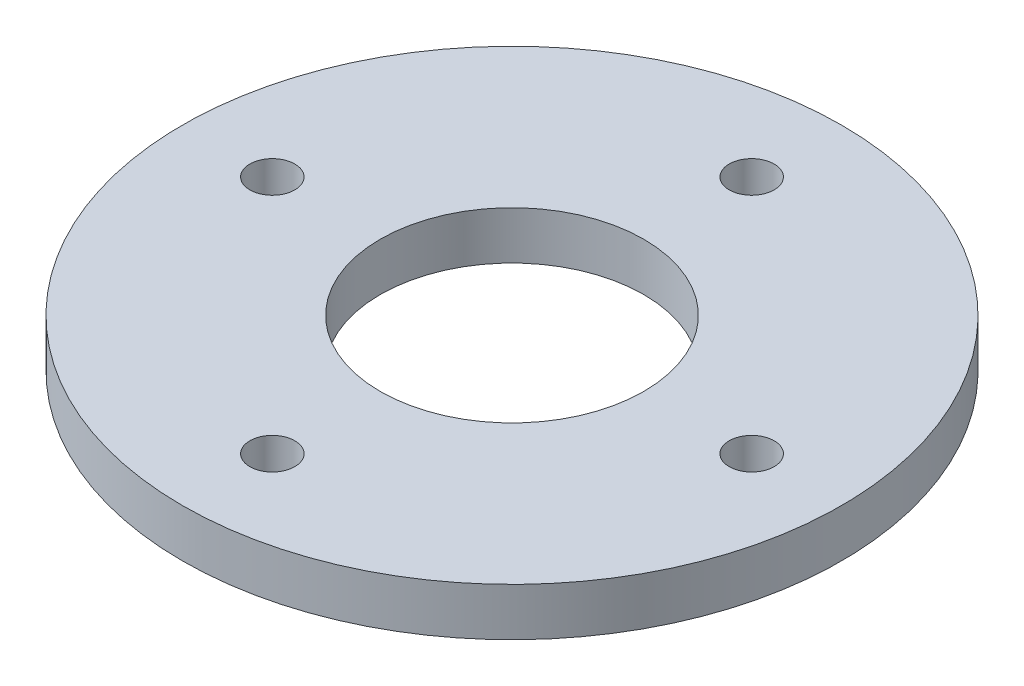
ISO-10303-21;
HEADER;
FILE_DESCRIPTION(('STEP AP214'),'2;1');
FILE_NAME('part.step','',(''),(''),'','','');
FILE_SCHEMA(('AUTOMOTIVE_DESIGN { 1 0 10303 214 1 1 1 1 }'));
ENDSEC;
DATA;
#1=APPLICATION_CONTEXT('core data for automotive mechanical design processes');
#2=APPLICATION_PROTOCOL_DEFINITION('international standard','automotive_design',2000,#1);
#3=PRODUCT_CONTEXT('',#1,'mechanical');
#4=PRODUCT('Part','Part','',(#3));
#5=PRODUCT_RELATED_PRODUCT_CATEGORY('part','',(#4));
#6=PRODUCT_DEFINITION_FORMATION('','',#4);
#7=PRODUCT_DEFINITION_CONTEXT('part definition',#1,'design');
#8=PRODUCT_DEFINITION('design','',#6,#7);
#9=PRODUCT_DEFINITION_SHAPE('','',#8);
#10=(LENGTH_UNIT() NAMED_UNIT(*) SI_UNIT(.MILLI.,.METRE.));
#11=(NAMED_UNIT(*) PLANE_ANGLE_UNIT() SI_UNIT($,.RADIAN.));
#12=(NAMED_UNIT(*) SI_UNIT($,.STERADIAN.) SOLID_ANGLE_UNIT());
#13=UNCERTAINTY_MEASURE_WITH_UNIT(LENGTH_MEASURE(1.E-05),#10,'distance_accuracy_value','');
#14=(GEOMETRIC_REPRESENTATION_CONTEXT(3) GLOBAL_UNCERTAINTY_ASSIGNED_CONTEXT((#13)) GLOBAL_UNIT_ASSIGNED_CONTEXT((#10,
#11,#12)) REPRESENTATION_CONTEXT('',''));
#15=CARTESIAN_POINT('',(0.,0.,0.));
#16=DIRECTION('',(0.,0.,1.));
#17=DIRECTION('',(1.,0.,0.));
#18=AXIS2_PLACEMENT_3D('',#15,#16,#17);
#19=CARTESIAN_POINT('',(0.,4.,0.));
#20=DIRECTION('',(0.,1.,0.));
#21=DIRECTION('',(0.,0.,1.));
#22=AXIS2_PLACEMENT_3D('',#19,#20,#21);
#23=PLANE('',#22);
#24=CARTESIAN_POINT('',(0.,4.,0.));
#25=DIRECTION('',(0.,1.,0.));
#26=DIRECTION('',(0.,0.,1.));
#27=AXIS2_PLACEMENT_3D('',#24,#25,#26);
#28=CIRCLE('',#27,11.);
#29=CARTESIAN_POINT('',(0.,4.,11.));
#30=VERTEX_POINT('',#29);
#31=EDGE_CURVE('E52',#30,#30,#28,.T.);
#32=ORIENTED_EDGE('',*,*,#31,.F.);
#33=EDGE_LOOP('',(#32));
#34=FACE_BOUND('',#33,.T.);
#35=CARTESIAN_POINT('',(0.,4.,0.));
#36=DIRECTION('',(0.,1.,0.));
#37=DIRECTION('',(0.,0.,1.));
#38=AXIS2_PLACEMENT_3D('',#35,#36,#37);
#39=CIRCLE('',#38,27.5);
#40=CARTESIAN_POINT('',(0.,4.,27.5));
#41=VERTEX_POINT('',#40);
#42=EDGE_CURVE('E10',#41,#41,#39,.T.);
#43=ORIENTED_EDGE('',*,*,#42,.T.);
#44=EDGE_LOOP('',(#43));
#45=FACE_BOUND('',#44,.T.);
#46=CARTESIAN_POINT('',(0.,4.,20.));
#47=DIRECTION('',(0.,1.,0.));
#48=DIRECTION('',(0.,0.,1.));
#49=AXIS2_PLACEMENT_3D('',#46,#47,#48);
#50=CIRCLE('',#49,1.875);
#51=CARTESIAN_POINT('',(0.,4.,21.875));
#52=VERTEX_POINT('',#51);
#53=EDGE_CURVE('E58',#52,#52,#50,.T.);
#54=ORIENTED_EDGE('',*,*,#53,.F.);
#55=EDGE_LOOP('',(#54));
#56=FACE_BOUND('',#55,.T.);
#57=CARTESIAN_POINT('',(20.,4.,0.));
#58=DIRECTION('',(0.,1.,0.));
#59=DIRECTION('',(0.,0.,1.));
#60=AXIS2_PLACEMENT_3D('',#57,#58,#59);
#61=CIRCLE('',#60,1.875);
#62=CARTESIAN_POINT('',(20.,4.,1.875));
#63=VERTEX_POINT('',#62);
#64=EDGE_CURVE('E64',#63,#63,#61,.T.);
#65=ORIENTED_EDGE('',*,*,#64,.F.);
#66=EDGE_LOOP('',(#65));
#67=FACE_BOUND('',#66,.T.);
#68=CARTESIAN_POINT('',(0.,4.,-20.));
#69=DIRECTION('',(0.,1.,0.));
#70=DIRECTION('',(0.,0.,1.));
#71=AXIS2_PLACEMENT_3D('',#68,#69,#70);
#72=CIRCLE('',#71,1.875);
#73=CARTESIAN_POINT('',(0.,4.,-18.125));
#74=VERTEX_POINT('',#73);
#75=EDGE_CURVE('E70',#74,#74,#72,.T.);
#76=ORIENTED_EDGE('',*,*,#75,.F.);
#77=EDGE_LOOP('',(#76));
#78=FACE_BOUND('',#77,.T.);
#79=CARTESIAN_POINT('',(-20.,4.,0.));
#80=DIRECTION('',(0.,1.,0.));
#81=DIRECTION('',(0.,0.,1.));
#82=AXIS2_PLACEMENT_3D('',#79,#80,#81);
#83=CIRCLE('',#82,1.875);
#84=CARTESIAN_POINT('',(-20.,4.,1.875));
#85=VERTEX_POINT('',#84);
#86=EDGE_CURVE('E76',#85,#85,#83,.T.);
#87=ORIENTED_EDGE('',*,*,#86,.F.);
#88=EDGE_LOOP('',(#87));
#89=FACE_BOUND('',#88,.T.);
#90=ADVANCED_FACE('F38',(#34,#45,#56,#67,#78,#89),#23,.T.);
#91=CARTESIAN_POINT('',(0.,0.,0.));
#92=DIRECTION('',(0.,1.,0.));
#93=DIRECTION('',(0.,0.,1.));
#94=AXIS2_PLACEMENT_3D('',#91,#92,#93);
#95=PLANE('',#94);
#96=CARTESIAN_POINT('',(0.,0.,0.));
#97=DIRECTION('',(0.,1.,0.));
#98=DIRECTION('',(0.,0.,1.));
#99=AXIS2_PLACEMENT_3D('',#96,#97,#98);
#100=CIRCLE('',#99,11.);
#101=CARTESIAN_POINT('',(0.,0.,11.));
#102=VERTEX_POINT('',#101);
#103=EDGE_CURVE('E42',#102,#102,#100,.T.);
#104=ORIENTED_EDGE('',*,*,#103,.T.);
#105=EDGE_LOOP('',(#104));
#106=FACE_BOUND('',#105,.T.);
#107=CARTESIAN_POINT('',(0.,0.,0.));
#108=DIRECTION('',(0.,1.,0.));
#109=DIRECTION('',(0.,0.,1.));
#110=AXIS2_PLACEMENT_3D('',#107,#108,#109);
#111=CIRCLE('',#110,27.5);
#112=CARTESIAN_POINT('',(0.,0.,27.5));
#113=VERTEX_POINT('',#112);
#114=EDGE_CURVE('E46',#113,#113,#111,.T.);
#115=ORIENTED_EDGE('',*,*,#114,.F.);
#116=EDGE_LOOP('',(#115));
#117=FACE_BOUND('',#116,.T.);
#118=CARTESIAN_POINT('',(0.,0.,20.));
#119=DIRECTION('',(0.,1.,0.));
#120=DIRECTION('',(0.,0.,1.));
#121=AXIS2_PLACEMENT_3D('',#118,#119,#120);
#122=CIRCLE('',#121,1.875);
#123=CARTESIAN_POINT('',(0.,0.,21.875));
#124=VERTEX_POINT('',#123);
#125=EDGE_CURVE('E55',#124,#124,#122,.F.);
#126=ORIENTED_EDGE('',*,*,#125,.F.);
#127=EDGE_LOOP('',(#126));
#128=FACE_BOUND('',#127,.T.);
#129=CARTESIAN_POINT('',(20.,0.,0.));
#130=DIRECTION('',(0.,1.,0.));
#131=DIRECTION('',(0.,0.,1.));
#132=AXIS2_PLACEMENT_3D('',#129,#130,#131);
#133=CIRCLE('',#132,1.875);
#134=CARTESIAN_POINT('',(20.,0.,1.875));
#135=VERTEX_POINT('',#134);
#136=EDGE_CURVE('E61',#135,#135,#133,.F.);
#137=ORIENTED_EDGE('',*,*,#136,.F.);
#138=EDGE_LOOP('',(#137));
#139=FACE_BOUND('',#138,.T.);
#140=CARTESIAN_POINT('',(0.,0.,-20.));
#141=DIRECTION('',(0.,1.,0.));
#142=DIRECTION('',(0.,0.,1.));
#143=AXIS2_PLACEMENT_3D('',#140,#141,#142);
#144=CIRCLE('',#143,1.875);
#145=CARTESIAN_POINT('',(0.,0.,-18.125));
#146=VERTEX_POINT('',#145);
#147=EDGE_CURVE('E67',#146,#146,#144,.F.);
#148=ORIENTED_EDGE('',*,*,#147,.F.);
#149=EDGE_LOOP('',(#148));
#150=FACE_BOUND('',#149,.T.);
#151=CARTESIAN_POINT('',(-20.,0.,0.));
#152=DIRECTION('',(0.,1.,0.));
#153=DIRECTION('',(0.,0.,1.));
#154=AXIS2_PLACEMENT_3D('',#151,#152,#153);
#155=CIRCLE('',#154,1.875);
#156=CARTESIAN_POINT('',(-20.,0.,1.875));
#157=VERTEX_POINT('',#156);
#158=EDGE_CURVE('E73',#157,#157,#155,.F.);
#159=ORIENTED_EDGE('',*,*,#158,.F.);
#160=EDGE_LOOP('',(#159));
#161=FACE_BOUND('',#160,.T.);
#162=ADVANCED_FACE('F83',(#106,#117,#128,#139,#150,#161),#95,.F.);
#163=CARTESIAN_POINT('',(0.,4.,0.));
#164=DIRECTION('',(0.,-1.,0.));
#165=DIRECTION('',(0.,0.,-1.));
#166=AXIS2_PLACEMENT_3D('',#163,#164,#165);
#167=CYLINDRICAL_SURFACE('',#166,27.5);
#168=ORIENTED_EDGE('',*,*,#42,.F.);
#169=EDGE_LOOP('',(#168));
#170=FACE_BOUND('',#169,.T.);
#171=ORIENTED_EDGE('',*,*,#114,.T.);
#172=EDGE_LOOP('',(#171));
#173=FACE_BOUND('',#172,.T.);
#174=ADVANCED_FACE('F40',(#170,#173),#167,.T.);
#175=CARTESIAN_POINT('',(0.,-11.,0.));
#176=DIRECTION('',(0.,1.,0.));
#177=DIRECTION('',(0.,0.,1.));
#178=AXIS2_PLACEMENT_3D('',#175,#176,#177);
#179=CYLINDRICAL_SURFACE('',#178,11.);
#180=ORIENTED_EDGE('',*,*,#31,.T.);
#181=EDGE_LOOP('',(#180));
#182=FACE_BOUND('',#181,.T.);
#183=ORIENTED_EDGE('',*,*,#103,.F.);
#184=EDGE_LOOP('',(#183));
#185=FACE_BOUND('',#184,.T.);
#186=ADVANCED_FACE('F92',(#182,#185),#179,.F.);
#187=CARTESIAN_POINT('',(0.,-7.07106781186548,20.));
#188=DIRECTION('',(0.,1.,0.));
#189=DIRECTION('',(0.,0.,1.));
#190=AXIS2_PLACEMENT_3D('',#187,#188,#189);
#191=CYLINDRICAL_SURFACE('',#190,1.875);
#192=ORIENTED_EDGE('',*,*,#125,.T.);
#193=EDGE_LOOP('',(#192));
#194=FACE_BOUND('',#193,.T.);
#195=ORIENTED_EDGE('',*,*,#53,.T.);
#196=EDGE_LOOP('',(#195));
#197=FACE_BOUND('',#196,.T.);
#198=ADVANCED_FACE('F95',(#194,#197),#191,.F.);
#199=CARTESIAN_POINT('',(20.,-7.07106781186548,0.));
#200=DIRECTION('',(0.,1.,0.));
#201=DIRECTION('',(0.,0.,1.));
#202=AXIS2_PLACEMENT_3D('',#199,#200,#201);
#203=CYLINDRICAL_SURFACE('',#202,1.875);
#204=ORIENTED_EDGE('',*,*,#136,.T.);
#205=EDGE_LOOP('',(#204));
#206=FACE_BOUND('',#205,.T.);
#207=ORIENTED_EDGE('',*,*,#64,.T.);
#208=EDGE_LOOP('',(#207));
#209=FACE_BOUND('',#208,.T.);
#210=ADVANCED_FACE('F99',(#206,#209),#203,.F.);
#211=CARTESIAN_POINT('',(0.,-7.07106781186548,-20.));
#212=DIRECTION('',(0.,1.,0.));
#213=DIRECTION('',(0.,0.,1.));
#214=AXIS2_PLACEMENT_3D('',#211,#212,#213);
#215=CYLINDRICAL_SURFACE('',#214,1.875);
#216=ORIENTED_EDGE('',*,*,#147,.T.);
#217=EDGE_LOOP('',(#216));
#218=FACE_BOUND('',#217,.T.);
#219=ORIENTED_EDGE('',*,*,#75,.T.);
#220=EDGE_LOOP('',(#219));
#221=FACE_BOUND('',#220,.T.);
#222=ADVANCED_FACE('F103',(#218,#221),#215,.F.);
#223=CARTESIAN_POINT('',(-20.,-7.07106781186548,0.));
#224=DIRECTION('',(0.,1.,0.));
#225=DIRECTION('',(0.,0.,1.));
#226=AXIS2_PLACEMENT_3D('',#223,#224,#225);
#227=CYLINDRICAL_SURFACE('',#226,1.875);
#228=ORIENTED_EDGE('',*,*,#158,.T.);
#229=EDGE_LOOP('',(#228));
#230=FACE_BOUND('',#229,.T.);
#231=ORIENTED_EDGE('',*,*,#86,.T.);
#232=EDGE_LOOP('',(#231));
#233=FACE_BOUND('',#232,.T.);
#234=ADVANCED_FACE('F80',(#230,#233),#227,.F.);
#235=CLOSED_SHELL('',(#90,#162,#174,#186,#198,#210,#222,#234));
#236=MANIFOLD_SOLID_BREP('B2',#235);
#237=ADVANCED_BREP_SHAPE_REPRESENTATION('',(#18,#236),#14);
#238=SHAPE_DEFINITION_REPRESENTATION(#9,#237);
ENDSEC;
END-ISO-10303-21;
